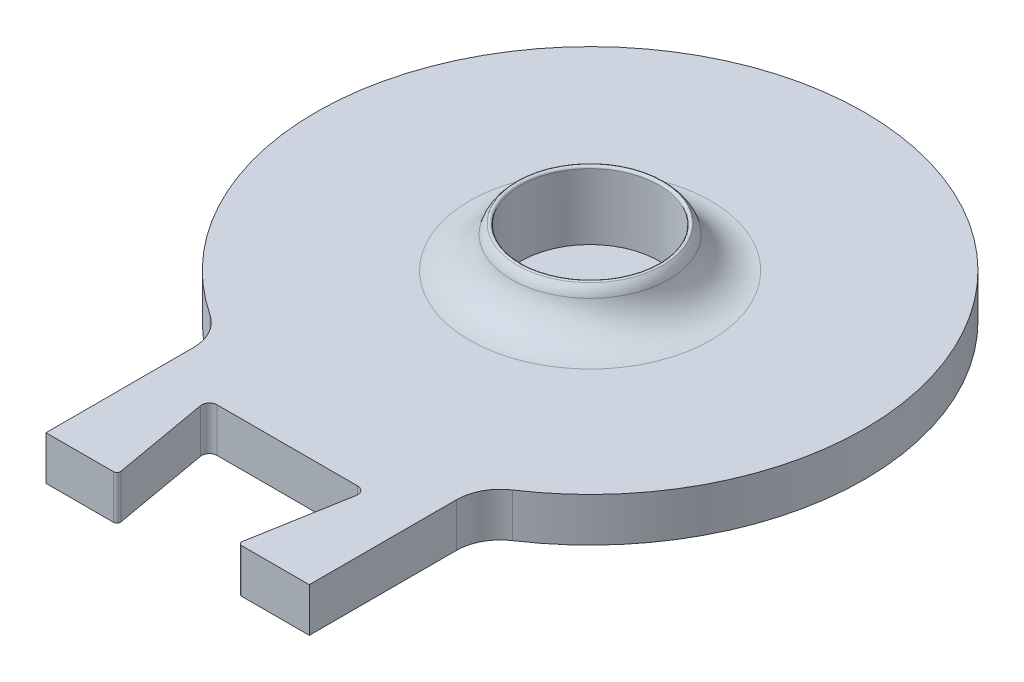
ISO-10303-21;
HEADER;
FILE_DESCRIPTION(('STEP AP214'),'2;1');
FILE_NAME('part.step','',(''),(''),'','','');
FILE_SCHEMA(('AUTOMOTIVE_DESIGN { 1 0 10303 214 1 1 1 1 }'));
ENDSEC;
DATA;
#1=APPLICATION_CONTEXT('core data for automotive mechanical design processes');
#2=APPLICATION_PROTOCOL_DEFINITION('international standard','automotive_design',2000,#1);
#3=PRODUCT_CONTEXT('',#1,'mechanical');
#4=PRODUCT('Part','Part','',(#3));
#5=PRODUCT_RELATED_PRODUCT_CATEGORY('part','',(#4));
#6=PRODUCT_DEFINITION_FORMATION('','',#4);
#7=PRODUCT_DEFINITION_CONTEXT('part definition',#1,'design');
#8=PRODUCT_DEFINITION('design','',#6,#7);
#9=PRODUCT_DEFINITION_SHAPE('','',#8);
#10=(LENGTH_UNIT() NAMED_UNIT(*) SI_UNIT(.MILLI.,.METRE.));
#11=(NAMED_UNIT(*) PLANE_ANGLE_UNIT() SI_UNIT($,.RADIAN.));
#12=(NAMED_UNIT(*) SI_UNIT($,.STERADIAN.) SOLID_ANGLE_UNIT());
#13=UNCERTAINTY_MEASURE_WITH_UNIT(LENGTH_MEASURE(1.E-05),#10,'distance_accuracy_value','');
#14=(GEOMETRIC_REPRESENTATION_CONTEXT(3) GLOBAL_UNCERTAINTY_ASSIGNED_CONTEXT((#13)) GLOBAL_UNIT_ASSIGNED_CONTEXT((#10,
#11,#12)) REPRESENTATION_CONTEXT('',''));
#15=CARTESIAN_POINT('',(0.,0.,0.));
#16=DIRECTION('',(0.,0.,1.));
#17=DIRECTION('',(1.,0.,0.));
#18=AXIS2_PLACEMENT_3D('',#15,#16,#17);
#19=CARTESIAN_POINT('',(0.,2.,0.));
#20=DIRECTION('',(0.,1.,0.));
#21=DIRECTION('',(0.,0.,1.));
#22=AXIS2_PLACEMENT_3D('',#19,#20,#21);
#23=PLANE('',#22);
#24=CARTESIAN_POINT('',(0.,2.,0.));
#25=DIRECTION('',(0.,1.,0.));
#26=DIRECTION('',(0.,0.,1.));
#27=AXIS2_PLACEMENT_3D('',#24,#25,#26);
#28=CIRCLE('',#27,5.5);
#29=CARTESIAN_POINT('',(0.,2.,5.5));
#30=VERTEX_POINT('',#29);
#31=EDGE_CURVE('E230',#30,#30,#28,.F.);
#32=ORIENTED_EDGE('',*,*,#31,.T.);
#33=EDGE_LOOP('',(#32));
#34=FACE_BOUND('',#33,.T.);
#35=DIRECTION('',(-0.173648177666934,0.,0.984807753012207));
#36=VECTOR('',#35,1.);
#37=CARTESIAN_POINT('',(2.70227505957538,2.,19.));
#38=LINE('',#37,#36);
#39=CARTESIAN_POINT('',(3.54674431540572,2.,14.2107768621834));
#40=VERTEX_POINT('',#39);
#41=CARTESIAN_POINT('',(2.76858233165438,2.,18.62395277335));
#42=VERTEX_POINT('',#41);
#43=EDGE_CURVE('E155',#40,#42,#38,.T.);
#44=ORIENTED_EDGE('',*,*,#43,.T.);
#45=CARTESIAN_POINT('',(2.91630349460621,2.,18.65));
#46=DIRECTION('',(0.,1.,0.));
#47=DIRECTION('',(0.,0.,1.));
#48=AXIS2_PLACEMENT_3D('',#45,#46,#47);
#49=CIRCLE('',#48,0.15);
#50=CARTESIAN_POINT('',(2.91630349460621,2.,18.8));
#51=VERTEX_POINT('',#50);
#52=EDGE_CURVE('E150',#42,#51,#49,.T.);
#53=ORIENTED_EDGE('',*,*,#52,.T.);
#54=DIRECTION('',(-1.,0.,0.));
#55=VECTOR('',#54,1.);
#56=CARTESIAN_POINT('',(-6.,2.,18.8));
#57=LINE('',#56,#55);
#58=CARTESIAN_POINT('',(6.,2.,18.8));
#59=VERTEX_POINT('',#58);
#60=EDGE_CURVE('E140',#59,#51,#57,.T.);
#61=ORIENTED_EDGE('',*,*,#60,.F.);
#62=DIRECTION('',(0.,0.,-1.));
#63=VECTOR('',#62,1.);
#64=CARTESIAN_POINT('',(6.,2.,19.));
#65=LINE('',#64,#63);
#66=CARTESIAN_POINT('',(6.,2.,12.0933866224478));
#67=VERTEX_POINT('',#66);
#68=EDGE_CURVE('E148',#59,#67,#65,.T.);
#69=ORIENTED_EDGE('',*,*,#68,.T.);
#70=CARTESIAN_POINT('',(8.,2.,12.0933866224478));
#71=DIRECTION('',(0.,1.,0.));
#72=DIRECTION('',(0.,0.,1.));
#73=AXIS2_PLACEMENT_3D('',#70,#71,#72);
#74=CIRCLE('',#73,2.);
#75=CARTESIAN_POINT('',(6.89655172413793,2.,10.4253332952136));
#76=VERTEX_POINT('',#75);
#77=EDGE_CURVE('E228',#67,#76,#74,.F.);
#78=ORIENTED_EDGE('',*,*,#77,.T.);
#79=CARTESIAN_POINT('',(0.,2.,0.));
#80=DIRECTION('',(0.,1.,0.));
#81=DIRECTION('',(0.,0.,1.));
#82=AXIS2_PLACEMENT_3D('',#79,#80,#81);
#83=CIRCLE('',#82,12.5);
#84=CARTESIAN_POINT('',(-6.89655172413793,2.,10.4253332952136));
#85=VERTEX_POINT('',#84);
#86=EDGE_CURVE('E166',#76,#85,#83,.T.);
#87=ORIENTED_EDGE('',*,*,#86,.T.);
#88=CARTESIAN_POINT('',(-8.,2.,12.0933866224478));
#89=DIRECTION('',(0.,1.,0.));
#90=DIRECTION('',(0.,0.,1.));
#91=AXIS2_PLACEMENT_3D('',#88,#89,#90);
#92=CIRCLE('',#91,2.);
#93=CARTESIAN_POINT('',(-6.,2.,12.0933866224478));
#94=VERTEX_POINT('',#93);
#95=EDGE_CURVE('E223',#85,#94,#92,.F.);
#96=ORIENTED_EDGE('',*,*,#95,.T.);
#97=DIRECTION('',(0.,0.,1.));
#98=VECTOR('',#97,1.);
#99=CARTESIAN_POINT('',(-6.,2.,-6.));
#100=LINE('',#99,#98);
#101=CARTESIAN_POINT('',(-6.,2.,18.8));
#102=VERTEX_POINT('',#101);
#103=EDGE_CURVE('E175',#94,#102,#100,.T.);
#104=ORIENTED_EDGE('',*,*,#103,.T.);
#105=CARTESIAN_POINT('',(-2.91630349460621,2.,18.8));
#106=VERTEX_POINT('',#105);
#107=EDGE_CURVE('E151',#106,#102,#57,.T.);
#108=ORIENTED_EDGE('',*,*,#107,.F.);
#109=CARTESIAN_POINT('',(-2.91630349460621,2.,18.65));
#110=DIRECTION('',(0.,1.,0.));
#111=DIRECTION('',(0.,0.,1.));
#112=AXIS2_PLACEMENT_3D('',#109,#110,#111);
#113=CIRCLE('',#112,0.15);
#114=CARTESIAN_POINT('',(-2.76858233165438,2.,18.62395277335));
#115=VERTEX_POINT('',#114);
#116=EDGE_CURVE('E200',#106,#115,#113,.T.);
#117=ORIENTED_EDGE('',*,*,#116,.T.);
#118=DIRECTION('',(-0.173648177666935,0.,-0.984807753012207));
#119=VECTOR('',#118,1.);
#120=CARTESIAN_POINT('',(-2.70227505957538,2.,19.));
#121=LINE('',#120,#119);
#122=CARTESIAN_POINT('',(-3.54674431540572,2.,14.2107768621834));
#123=VERTEX_POINT('',#122);
#124=EDGE_CURVE('E347',#115,#123,#121,.T.);
#125=ORIENTED_EDGE('',*,*,#124,.T.);
#126=CARTESIAN_POINT('',(-3.20206160185145,2.,14.15));
#127=DIRECTION('',(0.,1.,0.));
#128=DIRECTION('',(0.,0.,1.));
#129=AXIS2_PLACEMENT_3D('',#126,#127,#128);
#130=CIRCLE('',#129,0.35);
#131=CARTESIAN_POINT('',(-3.20206160185145,2.,13.8));
#132=VERTEX_POINT('',#131);
#133=EDGE_CURVE('E195',#123,#132,#130,.F.);
#134=ORIENTED_EDGE('',*,*,#133,.T.);
#135=DIRECTION('',(1.,0.,0.));
#136=VECTOR('',#135,1.);
#137=CARTESIAN_POINT('',(-3.61917535925942,2.,13.8));
#138=LINE('',#137,#136);
#139=CARTESIAN_POINT('',(3.20206160185144,2.,13.8));
#140=VERTEX_POINT('',#139);
#141=EDGE_CURVE('E159',#132,#140,#138,.T.);
#142=ORIENTED_EDGE('',*,*,#141,.T.);
#143=CARTESIAN_POINT('',(3.20206160185145,2.,14.15));
#144=DIRECTION('',(0.,1.,0.));
#145=DIRECTION('',(0.,0.,1.));
#146=AXIS2_PLACEMENT_3D('',#143,#144,#145);
#147=CIRCLE('',#146,0.35);
#148=EDGE_CURVE('E190',#140,#40,#147,.F.);
#149=ORIENTED_EDGE('',*,*,#148,.T.);
#150=EDGE_LOOP('',(#44,#53,#61,#69,#78,#87,#96,#104,#108,#117,#125,#134,#142,#149));
#151=FACE_BOUND('',#150,.T.);
#152=ADVANCED_FACE('F34',(#34,#151),#23,.T.);
#153=CARTESIAN_POINT('',(-6.,2.,13.2915026221292));
#154=DIRECTION('',(1.,0.,0.));
#155=DIRECTION('',(0.,0.,-1.));
#156=AXIS2_PLACEMENT_3D('',#153,#154,#155);
#157=PLANE('',#156);
#158=ORIENTED_EDGE('',*,*,#103,.F.);
#159=DIRECTION('',(0.,1.,0.));
#160=VECTOR('',#159,1.);
#161=CARTESIAN_POINT('',(-6.,0.,12.0933866224478));
#162=LINE('',#161,#160);
#163=CARTESIAN_POINT('',(-6.,0.,12.0933866224478));
#164=VERTEX_POINT('',#163);
#165=EDGE_CURVE('E220',#94,#164,#162,.F.);
#166=ORIENTED_EDGE('',*,*,#165,.T.);
#167=DIRECTION('',(0.,0.,1.));
#168=VECTOR('',#167,1.);
#169=CARTESIAN_POINT('',(-6.,0.,13.2915026221292));
#170=LINE('',#169,#168);
#171=CARTESIAN_POINT('',(-6.,0.,18.8));
#172=VERTEX_POINT('',#171);
#173=EDGE_CURVE('E163',#164,#172,#170,.T.);
#174=ORIENTED_EDGE('',*,*,#173,.T.);
#175=DIRECTION('',(0.,1.,0.));
#176=VECTOR('',#175,1.);
#177=CARTESIAN_POINT('',(-6.,-2.,18.8));
#178=LINE('',#177,#176);
#179=EDGE_CURVE('E144',#172,#102,#178,.T.);
#180=ORIENTED_EDGE('',*,*,#179,.T.);
#181=EDGE_LOOP('',(#158,#166,#174,#180));
#182=FACE_BOUND('',#181,.T.);
#183=ADVANCED_FACE('F255',(#182),#157,.F.);
#184=CARTESIAN_POINT('',(6.,2.,13.2915026221292));
#185=DIRECTION('',(-1.,0.,0.));
#186=DIRECTION('',(0.,0.,1.));
#187=AXIS2_PLACEMENT_3D('',#184,#185,#186);
#188=PLANE('',#187);
#189=DIRECTION('',(0.,0.,-1.));
#190=VECTOR('',#189,1.);
#191=CARTESIAN_POINT('',(6.,0.,13.2915026221292));
#192=LINE('',#191,#190);
#193=CARTESIAN_POINT('',(6.,0.,18.8));
#194=VERTEX_POINT('',#193);
#195=CARTESIAN_POINT('',(6.,0.,12.0933866224478));
#196=VERTEX_POINT('',#195);
#197=EDGE_CURVE('E174',#194,#196,#192,.T.);
#198=ORIENTED_EDGE('',*,*,#197,.T.);
#199=DIRECTION('',(0.,1.,0.));
#200=VECTOR('',#199,1.);
#201=CARTESIAN_POINT('',(6.,2.,12.0933866224478));
#202=LINE('',#201,#200);
#203=EDGE_CURVE('E56',#196,#67,#202,.T.);
#204=ORIENTED_EDGE('',*,*,#203,.T.);
#205=ORIENTED_EDGE('',*,*,#68,.F.);
#206=DIRECTION('',(0.,1.,0.));
#207=VECTOR('',#206,1.);
#208=CARTESIAN_POINT('',(6.,-2.,18.8));
#209=LINE('',#208,#207);
#210=EDGE_CURVE('E137',#194,#59,#209,.T.);
#211=ORIENTED_EDGE('',*,*,#210,.F.);
#212=EDGE_LOOP('',(#198,#204,#205,#211));
#213=FACE_BOUND('',#212,.T.);
#214=ADVANCED_FACE('F153',(#213),#188,.F.);
#215=CARTESIAN_POINT('',(-2.70227505957538,2.,19.));
#216=DIRECTION('',(-0.984807753012207,0.,0.173648177666935));
#217=DIRECTION('',(0.173648177666935,0.,0.984807753012207));
#218=AXIS2_PLACEMENT_3D('',#215,#216,#217);
#219=PLANE('',#218);
#220=ORIENTED_EDGE('',*,*,#124,.F.);
#221=DIRECTION('',(0.,-1.,0.));
#222=VECTOR('',#221,1.);
#223=CARTESIAN_POINT('',(-2.76858233165438,2.,18.62395277335));
#224=LINE('',#223,#222);
#225=CARTESIAN_POINT('',(-2.76858233165438,0.,18.62395277335));
#226=VERTEX_POINT('',#225);
#227=EDGE_CURVE('E209',#115,#226,#224,.T.);
#228=ORIENTED_EDGE('',*,*,#227,.T.);
#229=DIRECTION('',(-0.173648177666935,0.,-0.984807753012207));
#230=VECTOR('',#229,1.);
#231=CARTESIAN_POINT('',(-2.70227505957538,0.,19.));
#232=LINE('',#231,#230);
#233=CARTESIAN_POINT('',(-3.54674431540572,0.,14.2107768621834));
#234=VERTEX_POINT('',#233);
#235=EDGE_CURVE('E165',#226,#234,#232,.T.);
#236=ORIENTED_EDGE('',*,*,#235,.T.);
#237=DIRECTION('',(0.,-1.,0.));
#238=VECTOR('',#237,1.);
#239=CARTESIAN_POINT('',(-3.54674431540572,2.,14.2107768621834));
#240=LINE('',#239,#238);
#241=EDGE_CURVE('E185',#234,#123,#240,.F.);
#242=ORIENTED_EDGE('',*,*,#241,.T.);
#243=EDGE_LOOP('',(#220,#228,#236,#242));
#244=FACE_BOUND('',#243,.T.);
#245=ADVANCED_FACE('F274',(#244),#219,.F.);
#246=CARTESIAN_POINT('',(3.61917535925942,2.,13.8));
#247=DIRECTION('',(0.,0.,-1.));
#248=DIRECTION('',(-1.,0.,0.));
#249=AXIS2_PLACEMENT_3D('',#246,#247,#248);
#250=PLANE('',#249);
#251=DIRECTION('',(1.,0.,0.));
#252=VECTOR('',#251,1.);
#253=CARTESIAN_POINT('',(3.61917535925942,0.,13.8));
#254=LINE('',#253,#252);
#255=CARTESIAN_POINT('',(-3.20206160185144,0.,13.8));
#256=VERTEX_POINT('',#255);
#257=CARTESIAN_POINT('',(3.20206160185145,0.,13.8));
#258=VERTEX_POINT('',#257);
#259=EDGE_CURVE('E168',#256,#258,#254,.T.);
#260=ORIENTED_EDGE('',*,*,#259,.T.);
#261=DIRECTION('',(0.,-1.,0.));
#262=VECTOR('',#261,1.);
#263=CARTESIAN_POINT('',(3.20206160185145,2.,13.8));
#264=LINE('',#263,#262);
#265=EDGE_CURVE('E183',#258,#140,#264,.F.);
#266=ORIENTED_EDGE('',*,*,#265,.T.);
#267=ORIENTED_EDGE('',*,*,#141,.F.);
#268=DIRECTION('',(0.,-1.,0.));
#269=VECTOR('',#268,1.);
#270=CARTESIAN_POINT('',(-3.20206160185145,0.,13.8));
#271=LINE('',#270,#269);
#272=EDGE_CURVE('E180',#132,#256,#271,.T.);
#273=ORIENTED_EDGE('',*,*,#272,.T.);
#274=EDGE_LOOP('',(#260,#266,#267,#273));
#275=FACE_BOUND('',#274,.T.);
#276=ADVANCED_FACE('F277',(#275),#250,.F.);
#277=CARTESIAN_POINT('',(2.70227505957538,2.,19.));
#278=DIRECTION('',(0.984807753012207,0.,0.173648177666934));
#279=DIRECTION('',(0.173648177666934,0.,-0.984807753012207));
#280=AXIS2_PLACEMENT_3D('',#277,#278,#279);
#281=PLANE('',#280);
#282=DIRECTION('',(-0.173648177666934,0.,0.984807753012207));
#283=VECTOR('',#282,1.);
#284=CARTESIAN_POINT('',(2.70227505957538,0.,19.));
#285=LINE('',#284,#283);
#286=CARTESIAN_POINT('',(3.54674431540572,0.,14.2107768621834));
#287=VERTEX_POINT('',#286);
#288=CARTESIAN_POINT('',(2.76858233165438,0.,18.62395277335));
#289=VERTEX_POINT('',#288);
#290=EDGE_CURVE('E171',#287,#289,#285,.T.);
#291=ORIENTED_EDGE('',*,*,#290,.T.);
#292=DIRECTION('',(0.,1.,0.));
#293=VECTOR('',#292,1.);
#294=CARTESIAN_POINT('',(2.76858233165438,2.,18.62395277335));
#295=LINE('',#294,#293);
#296=EDGE_CURVE('E197',#289,#42,#295,.T.);
#297=ORIENTED_EDGE('',*,*,#296,.T.);
#298=ORIENTED_EDGE('',*,*,#43,.F.);
#299=DIRECTION('',(0.,-1.,0.));
#300=VECTOR('',#299,1.);
#301=CARTESIAN_POINT('',(3.54674431540572,0.,14.2107768621834));
#302=LINE('',#301,#300);
#303=EDGE_CURVE('E177',#40,#287,#302,.T.);
#304=ORIENTED_EDGE('',*,*,#303,.T.);
#305=EDGE_LOOP('',(#291,#297,#298,#304));
#306=FACE_BOUND('',#305,.T.);
#307=ADVANCED_FACE('F270',(#306),#281,.F.);
#308=CARTESIAN_POINT('',(0.,0.,0.));
#309=DIRECTION('',(0.,1.,0.));
#310=DIRECTION('',(0.,0.,1.));
#311=AXIS2_PLACEMENT_3D('',#308,#309,#310);
#312=PLANE('',#311);
#313=CARTESIAN_POINT('',(0.,0.,0.));
#314=DIRECTION('',(0.,1.,0.));
#315=DIRECTION('',(0.,0.,1.));
#316=AXIS2_PLACEMENT_3D('',#313,#314,#315);
#317=CIRCLE('',#316,0.3);
#318=CARTESIAN_POINT('',(0.,0.,0.3));
#319=VERTEX_POINT('',#318);
#320=EDGE_CURVE('E364',#319,#319,#317,.T.);
#321=ORIENTED_EDGE('',*,*,#320,.T.);
#322=EDGE_LOOP('',(#321));
#323=FACE_BOUND('',#322,.T.);
#324=DIRECTION('',(-1.,0.,0.));
#325=VECTOR('',#324,1.);
#326=CARTESIAN_POINT('',(0.,0.,18.8));
#327=LINE('',#326,#325);
#328=CARTESIAN_POINT('',(2.91630349460621,0.,18.8));
#329=VERTEX_POINT('',#328);
#330=EDGE_CURVE('E143',#194,#329,#327,.T.);
#331=ORIENTED_EDGE('',*,*,#330,.T.);
#332=CARTESIAN_POINT('',(2.91630349460621,0.,18.65));
#333=DIRECTION('',(0.,1.,0.));
#334=DIRECTION('',(0.,0.,1.));
#335=AXIS2_PLACEMENT_3D('',#332,#333,#334);
#336=CIRCLE('',#335,0.15);
#337=EDGE_CURVE('E207',#329,#289,#336,.F.);
#338=ORIENTED_EDGE('',*,*,#337,.T.);
#339=ORIENTED_EDGE('',*,*,#290,.F.);
#340=CARTESIAN_POINT('',(3.20206160185145,0.,14.15));
#341=DIRECTION('',(0.,1.,0.));
#342=DIRECTION('',(0.,0.,1.));
#343=AXIS2_PLACEMENT_3D('',#340,#341,#342);
#344=CIRCLE('',#343,0.35);
#345=EDGE_CURVE('E188',#287,#258,#344,.T.);
#346=ORIENTED_EDGE('',*,*,#345,.T.);
#347=ORIENTED_EDGE('',*,*,#259,.F.);
#348=CARTESIAN_POINT('',(-3.20206160185145,0.,14.15));
#349=DIRECTION('',(0.,1.,0.));
#350=DIRECTION('',(0.,0.,1.));
#351=AXIS2_PLACEMENT_3D('',#348,#349,#350);
#352=CIRCLE('',#351,0.35);
#353=EDGE_CURVE('E192',#256,#234,#352,.T.);
#354=ORIENTED_EDGE('',*,*,#353,.T.);
#355=ORIENTED_EDGE('',*,*,#235,.F.);
#356=CARTESIAN_POINT('',(-2.91630349460621,0.,18.65));
#357=DIRECTION('',(0.,1.,0.));
#358=DIRECTION('',(0.,0.,1.));
#359=AXIS2_PLACEMENT_3D('',#356,#357,#358);
#360=CIRCLE('',#359,0.15);
#361=CARTESIAN_POINT('',(-2.91630349460621,0.,18.8));
#362=VERTEX_POINT('',#361);
#363=EDGE_CURVE('E205',#226,#362,#360,.F.);
#364=ORIENTED_EDGE('',*,*,#363,.T.);
#365=EDGE_CURVE('E154',#362,#172,#327,.T.);
#366=ORIENTED_EDGE('',*,*,#365,.T.);
#367=ORIENTED_EDGE('',*,*,#173,.F.);
#368=CARTESIAN_POINT('',(-8.,0.,12.0933866224478));
#369=DIRECTION('',(0.,1.,0.));
#370=DIRECTION('',(0.,0.,1.));
#371=AXIS2_PLACEMENT_3D('',#368,#369,#370);
#372=CIRCLE('',#371,2.);
#373=CARTESIAN_POINT('',(-6.89655172413793,0.,10.4253332952136));
#374=VERTEX_POINT('',#373);
#375=EDGE_CURVE('E225',#164,#374,#372,.T.);
#376=ORIENTED_EDGE('',*,*,#375,.T.);
#377=CARTESIAN_POINT('',(0.,0.,0.));
#378=DIRECTION('',(0.,1.,0.));
#379=DIRECTION('',(0.,0.,1.));
#380=AXIS2_PLACEMENT_3D('',#377,#378,#379);
#381=CIRCLE('',#380,12.5);
#382=CARTESIAN_POINT('',(6.89655172413793,0.,10.4253332952136));
#383=VERTEX_POINT('',#382);
#384=EDGE_CURVE('E355',#383,#374,#381,.T.);
#385=ORIENTED_EDGE('',*,*,#384,.F.);
#386=CARTESIAN_POINT('',(8.,0.,12.0933866224478));
#387=DIRECTION('',(0.,1.,0.));
#388=DIRECTION('',(0.,0.,1.));
#389=AXIS2_PLACEMENT_3D('',#386,#387,#388);
#390=CIRCLE('',#389,2.);
#391=EDGE_CURVE('E49',#383,#196,#390,.T.);
#392=ORIENTED_EDGE('',*,*,#391,.T.);
#393=ORIENTED_EDGE('',*,*,#197,.F.);
#394=EDGE_LOOP('',(#331,#338,#339,#346,#347,#354,#355,#364,#366,#367,#376,#385,#392,#393));
#395=FACE_BOUND('',#394,.T.);
#396=ADVANCED_FACE('F267',(#323,#395),#312,.F.);
#397=CARTESIAN_POINT('',(0.,2.,0.));
#398=DIRECTION('',(0.,-1.,0.));
#399=DIRECTION('',(0.,0.,-1.));
#400=AXIS2_PLACEMENT_3D('',#397,#398,#399);
#401=CYLINDRICAL_SURFACE('',#400,12.5);
#402=ORIENTED_EDGE('',*,*,#384,.T.);
#403=DIRECTION('',(0.,-1.,0.));
#404=VECTOR('',#403,1.);
#405=CARTESIAN_POINT('',(-6.89655172413793,2.,10.4253332952136));
#406=LINE('',#405,#404);
#407=EDGE_CURVE('E217',#374,#85,#406,.F.);
#408=ORIENTED_EDGE('',*,*,#407,.T.);
#409=ORIENTED_EDGE('',*,*,#86,.F.);
#410=DIRECTION('',(0.,-1.,0.));
#411=VECTOR('',#410,1.);
#412=CARTESIAN_POINT('',(6.89655172413793,2.,10.4253332952136));
#413=LINE('',#412,#411);
#414=EDGE_CURVE('E214',#76,#383,#413,.T.);
#415=ORIENTED_EDGE('',*,*,#414,.T.);
#416=EDGE_LOOP('',(#402,#408,#409,#415));
#417=FACE_BOUND('',#416,.T.);
#418=ADVANCED_FACE('F265',(#417),#401,.T.);
#419=CARTESIAN_POINT('',(-6.,-2.,18.8));
#420=DIRECTION('',(0.,0.,-1.));
#421=DIRECTION('',(-1.,0.,0.));
#422=AXIS2_PLACEMENT_3D('',#419,#420,#421);
#423=PLANE('',#422);
#424=ORIENTED_EDGE('',*,*,#365,.F.);
#425=DIRECTION('',(0.,-1.,0.));
#426=VECTOR('',#425,1.);
#427=CARTESIAN_POINT('',(-2.91630349460621,-2.,18.8));
#428=LINE('',#427,#426);
#429=EDGE_CURVE('E212',#362,#106,#428,.F.);
#430=ORIENTED_EDGE('',*,*,#429,.T.);
#431=ORIENTED_EDGE('',*,*,#107,.T.);
#432=ORIENTED_EDGE('',*,*,#179,.F.);
#433=EDGE_LOOP('',(#424,#430,#431,#432));
#434=FACE_BOUND('',#433,.T.);
#435=ADVANCED_FACE('F328',(#434),#423,.F.);
#436=ORIENTED_EDGE('',*,*,#60,.T.);
#437=DIRECTION('',(0.,1.,0.));
#438=VECTOR('',#437,1.);
#439=CARTESIAN_POINT('',(2.91630349460621,-2.,18.8));
#440=LINE('',#439,#438);
#441=EDGE_CURVE('E203',#51,#329,#440,.F.);
#442=ORIENTED_EDGE('',*,*,#441,.T.);
#443=ORIENTED_EDGE('',*,*,#330,.F.);
#444=ORIENTED_EDGE('',*,*,#210,.T.);
#445=EDGE_LOOP('',(#436,#442,#443,#444));
#446=FACE_BOUND('',#445,.T.);
#447=ADVANCED_FACE('F139',(#446),#423,.F.);
#448=CARTESIAN_POINT('',(3.20206160185145,2.,14.15));
#449=DIRECTION('',(0.,1.,0.));
#450=DIRECTION('',(0.,0.,1.));
#451=AXIS2_PLACEMENT_3D('',#448,#449,#450);
#452=CYLINDRICAL_SURFACE('',#451,0.35);
#453=ORIENTED_EDGE('',*,*,#148,.F.);
#454=ORIENTED_EDGE('',*,*,#265,.F.);
#455=ORIENTED_EDGE('',*,*,#345,.F.);
#456=ORIENTED_EDGE('',*,*,#303,.F.);
#457=EDGE_LOOP('',(#453,#454,#455,#456));
#458=FACE_BOUND('',#457,.T.);
#459=ADVANCED_FACE('F285',(#458),#452,.F.);
#460=CARTESIAN_POINT('',(-3.20206160185145,2.,14.15));
#461=DIRECTION('',(0.,1.,0.));
#462=DIRECTION('',(0.,0.,1.));
#463=AXIS2_PLACEMENT_3D('',#460,#461,#462);
#464=CYLINDRICAL_SURFACE('',#463,0.35);
#465=ORIENTED_EDGE('',*,*,#133,.F.);
#466=ORIENTED_EDGE('',*,*,#241,.F.);
#467=ORIENTED_EDGE('',*,*,#353,.F.);
#468=ORIENTED_EDGE('',*,*,#272,.F.);
#469=EDGE_LOOP('',(#465,#466,#467,#468));
#470=FACE_BOUND('',#469,.T.);
#471=ADVANCED_FACE('F288',(#470),#464,.F.);
#472=CARTESIAN_POINT('',(2.91630349460621,2.,18.65));
#473=DIRECTION('',(0.,1.,0.));
#474=DIRECTION('',(0.,0.,1.));
#475=AXIS2_PLACEMENT_3D('',#472,#473,#474);
#476=CYLINDRICAL_SURFACE('',#475,0.15);
#477=ORIENTED_EDGE('',*,*,#337,.F.);
#478=ORIENTED_EDGE('',*,*,#441,.F.);
#479=ORIENTED_EDGE('',*,*,#52,.F.);
#480=ORIENTED_EDGE('',*,*,#296,.F.);
#481=EDGE_LOOP('',(#477,#478,#479,#480));
#482=FACE_BOUND('',#481,.T.);
#483=ADVANCED_FACE('F292',(#482),#476,.T.);
#484=CARTESIAN_POINT('',(-2.91630349460621,2.,18.65));
#485=DIRECTION('',(0.,-1.,0.));
#486=DIRECTION('',(0.,0.,-1.));
#487=AXIS2_PLACEMENT_3D('',#484,#485,#486);
#488=CYLINDRICAL_SURFACE('',#487,0.15);
#489=ORIENTED_EDGE('',*,*,#116,.F.);
#490=ORIENTED_EDGE('',*,*,#429,.F.);
#491=ORIENTED_EDGE('',*,*,#363,.F.);
#492=ORIENTED_EDGE('',*,*,#227,.F.);
#493=EDGE_LOOP('',(#489,#490,#491,#492));
#494=FACE_BOUND('',#493,.T.);
#495=ADVANCED_FACE('F296',(#494),#488,.T.);
#496=CARTESIAN_POINT('',(-8.,2.,12.0933866224478));
#497=DIRECTION('',(0.,-1.,0.));
#498=DIRECTION('',(0.,0.,-1.));
#499=AXIS2_PLACEMENT_3D('',#496,#497,#498);
#500=CYLINDRICAL_SURFACE('',#499,2.);
#501=ORIENTED_EDGE('',*,*,#375,.F.);
#502=ORIENTED_EDGE('',*,*,#165,.F.);
#503=ORIENTED_EDGE('',*,*,#95,.F.);
#504=ORIENTED_EDGE('',*,*,#407,.F.);
#505=EDGE_LOOP('',(#501,#502,#503,#504));
#506=FACE_BOUND('',#505,.T.);
#507=ADVANCED_FACE('F300',(#506),#500,.F.);
#508=CARTESIAN_POINT('',(8.,2.,12.0933866224478));
#509=DIRECTION('',(0.,-1.,0.));
#510=DIRECTION('',(0.,0.,-1.));
#511=AXIS2_PLACEMENT_3D('',#508,#509,#510);
#512=CYLINDRICAL_SURFACE('',#511,2.);
#513=ORIENTED_EDGE('',*,*,#77,.F.);
#514=ORIENTED_EDGE('',*,*,#203,.F.);
#515=ORIENTED_EDGE('',*,*,#391,.F.);
#516=ORIENTED_EDGE('',*,*,#414,.F.);
#517=EDGE_LOOP('',(#513,#514,#515,#516));
#518=FACE_BOUND('',#517,.T.);
#519=ADVANCED_FACE('F304',(#518),#512,.F.);
#520=CARTESIAN_POINT('',(0.,0.8,0.));
#521=DIRECTION('',(0.,1.,0.));
#522=DIRECTION('',(0.,0.,1.));
#523=AXIS2_PLACEMENT_3D('',#520,#521,#522);
#524=CYLINDRICAL_SURFACE('',#523,3.15);
#525=CARTESIAN_POINT('',(0.,3.79574537668253,0.));
#526=DIRECTION('',(0.,-1.,0.));
#527=DIRECTION('',(0.,0.,-1.));
#528=AXIS2_PLACEMENT_3D('',#525,#526,#527);
#529=CIRCLE('',#528,3.15);
#530=CARTESIAN_POINT('',(0.,3.79574537668253,-3.15));
#531=VERTEX_POINT('',#530);
#532=EDGE_CURVE('E42',#531,#531,#529,.F.);
#533=ORIENTED_EDGE('',*,*,#532,.T.);
#534=EDGE_LOOP('',(#533));
#535=FACE_BOUND('',#534,.T.);
#536=CARTESIAN_POINT('',(0.,0.8,0.));
#537=DIRECTION('',(0.,1.,0.));
#538=DIRECTION('',(0.,0.,1.));
#539=AXIS2_PLACEMENT_3D('',#536,#537,#538);
#540=CIRCLE('',#539,3.15);
#541=CARTESIAN_POINT('',(0.,0.8,3.15));
#542=VERTEX_POINT('',#541);
#543=EDGE_CURVE('E361',#542,#542,#540,.T.);
#544=ORIENTED_EDGE('',*,*,#543,.F.);
#545=EDGE_LOOP('',(#544));
#546=FACE_BOUND('',#545,.T.);
#547=ADVANCED_FACE('F238',(#535,#546),#524,.F.);
#548=CARTESIAN_POINT('',(0.,0.8,0.));
#549=DIRECTION('',(0.,1.,0.));
#550=DIRECTION('',(0.,0.,1.));
#551=AXIS2_PLACEMENT_3D('',#548,#549,#550);
#552=PLANE('',#551);
#553=CARTESIAN_POINT('',(0.,0.8,0.));
#554=DIRECTION('',(0.,1.,0.));
#555=DIRECTION('',(0.,0.,1.));
#556=AXIS2_PLACEMENT_3D('',#553,#554,#555);
#557=CIRCLE('',#556,0.3);
#558=CARTESIAN_POINT('',(0.,0.8,0.3));
#559=VERTEX_POINT('',#558);
#560=EDGE_CURVE('E365',#559,#559,#557,.T.);
#561=ORIENTED_EDGE('',*,*,#560,.F.);
#562=EDGE_LOOP('',(#561));
#563=FACE_BOUND('',#562,.T.);
#564=ORIENTED_EDGE('',*,*,#543,.T.);
#565=EDGE_LOOP('',(#564));
#566=FACE_BOUND('',#565,.T.);
#567=ADVANCED_FACE('F310',(#563,#566),#552,.T.);
#568=CARTESIAN_POINT('',(0.,4.,0.));
#569=DIRECTION('',(0.,1.,0.));
#570=DIRECTION('',(0.,0.,1.));
#571=AXIS2_PLACEMENT_3D('',#568,#569,#570);
#572=TOROIDAL_SURFACE('',#571,5.5,2.);
#573=CARTESIAN_POINT('',(0.,3.4334759275443,0.));
#574=DIRECTION('',(0.,1.,0.));
#575=DIRECTION('',(0.,0.,1.));
#576=AXIS2_PLACEMENT_3D('',#573,#574,#575);
#577=CIRCLE('',#576,3.58191489361702);
#578=CARTESIAN_POINT('',(0.,3.4334759275443,3.58191489361702));
#579=VERTEX_POINT('',#578);
#580=EDGE_CURVE('E233',#579,#579,#577,.F.);
#581=ORIENTED_EDGE('',*,*,#580,.T.);
#582=EDGE_LOOP('',(#581));
#583=FACE_BOUND('',#582,.T.);
#584=ORIENTED_EDGE('',*,*,#31,.F.);
#585=EDGE_LOOP('',(#584));
#586=FACE_BOUND('',#585,.T.);
#587=ADVANCED_FACE('F251',(#583,#586),#572,.F.);
#588=CARTESIAN_POINT('',(0.,3.15021389131644,0.));
#589=DIRECTION('',(0.,1.,0.));
#590=DIRECTION('',(0.,0.,1.));
#591=AXIS2_PLACEMENT_3D('',#588,#589,#590);
#592=TOROIDAL_SURFACE('',#591,2.62287234042553,1.);
#593=CARTESIAN_POINT('',(0.,3.86747109727808,0.));
#594=DIRECTION('',(0.,-1.,0.));
#595=DIRECTION('',(0.,0.,-1.));
#596=AXIS2_PLACEMENT_3D('',#593,#594,#595);
#597=CIRCLE('',#596,3.3196808510625);
#598=CARTESIAN_POINT('',(0.,3.86747109727808,-3.3196808510625));
#599=VERTEX_POINT('',#598);
#600=EDGE_CURVE('E11',#599,#599,#597,.T.);
#601=ORIENTED_EDGE('',*,*,#600,.T.);
#602=EDGE_LOOP('',(#601));
#603=FACE_BOUND('',#602,.T.);
#604=ORIENTED_EDGE('',*,*,#580,.F.);
#605=EDGE_LOOP('',(#604));
#606=FACE_BOUND('',#605,.T.);
#607=ADVANCED_FACE('F243',(#603,#606),#592,.T.);
#608=CARTESIAN_POINT('',(0.,3.79574537668253,0.));
#609=DIRECTION('',(0.,-1.,0.));
#610=DIRECTION('',(0.,0.,-1.));
#611=AXIS2_PLACEMENT_3D('',#608,#609,#610);
#612=TOROIDAL_SURFACE('',#611,3.2499999999994,0.1);
#613=ORIENTED_EDGE('',*,*,#600,.F.);
#614=EDGE_LOOP('',(#613));
#615=FACE_BOUND('',#614,.T.);
#616=ORIENTED_EDGE('',*,*,#532,.F.);
#617=EDGE_LOOP('',(#616));
#618=FACE_BOUND('',#617,.T.);
#619=ADVANCED_FACE('F36',(#615,#618),#612,.T.);
#620=CARTESIAN_POINT('',(0.,0.,0.));
#621=DIRECTION('',(0.,1.,0.));
#622=DIRECTION('',(0.,0.,1.));
#623=AXIS2_PLACEMENT_3D('',#620,#621,#622);
#624=CYLINDRICAL_SURFACE('',#623,0.3);
#625=ORIENTED_EDGE('',*,*,#320,.F.);
#626=EDGE_LOOP('',(#625));
#627=FACE_BOUND('',#626,.T.);
#628=ORIENTED_EDGE('',*,*,#560,.T.);
#629=EDGE_LOOP('',(#628));
#630=FACE_BOUND('',#629,.T.);
#631=ADVANCED_FACE('F242',(#627,#630),#624,.F.);
#632=CLOSED_SHELL('',(#152,#183,#214,#245,#276,#307,#396,#418,#435,#447,#459,#471,#483,#495,
#507,#519,#547,#567,#587,#607,#619,#631));
#633=MANIFOLD_SOLID_BREP('B2',#632);
#634=ADVANCED_BREP_SHAPE_REPRESENTATION('',(#18,#633),#14);
#635=SHAPE_DEFINITION_REPRESENTATION(#9,#634);
ENDSEC;
END-ISO-10303-21;
